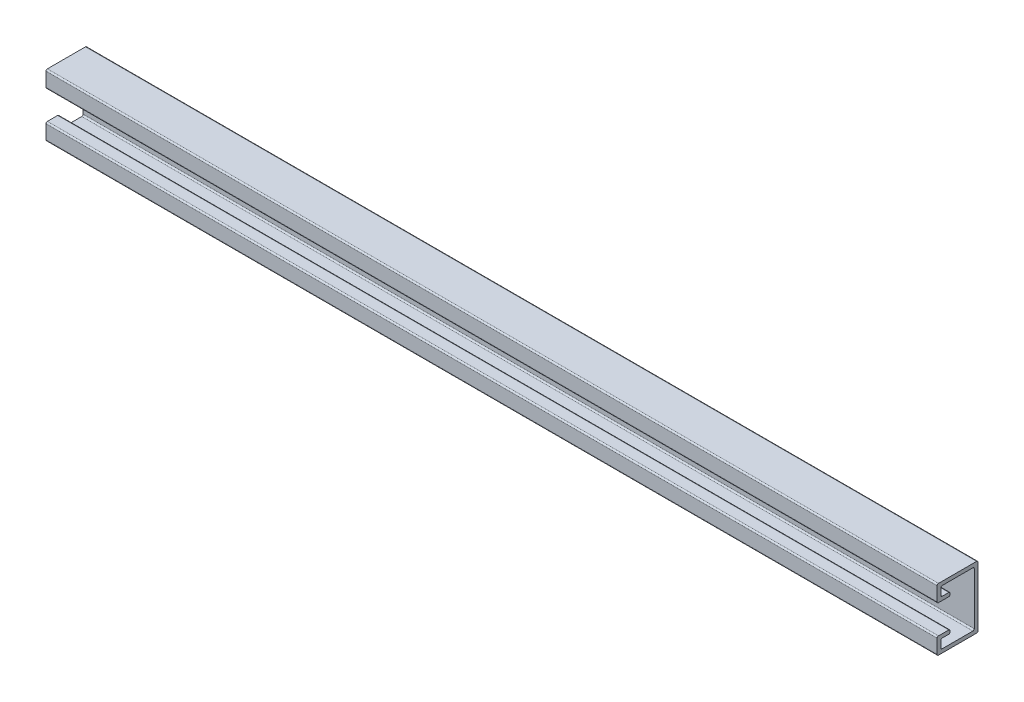
ISO-10303-21;
HEADER;
FILE_DESCRIPTION(('STEP AP214'),'2;1');
FILE_NAME('part.step','',(''),(''),'','','');
FILE_SCHEMA(('AUTOMOTIVE_DESIGN { 1 0 10303 214 1 1 1 1 }'));
ENDSEC;
DATA;
#1=APPLICATION_CONTEXT('core data for automotive mechanical design processes');
#2=APPLICATION_PROTOCOL_DEFINITION('international standard','automotive_design',2000,#1);
#3=PRODUCT_CONTEXT('',#1,'mechanical');
#4=PRODUCT('Part','Part','',(#3));
#5=PRODUCT_RELATED_PRODUCT_CATEGORY('part','',(#4));
#6=PRODUCT_DEFINITION_FORMATION('','',#4);
#7=PRODUCT_DEFINITION_CONTEXT('part definition',#1,'design');
#8=PRODUCT_DEFINITION('design','',#6,#7);
#9=PRODUCT_DEFINITION_SHAPE('','',#8);
#10=(LENGTH_UNIT() NAMED_UNIT(*) SI_UNIT(.MILLI.,.METRE.));
#11=(NAMED_UNIT(*) PLANE_ANGLE_UNIT() SI_UNIT($,.RADIAN.));
#12=(NAMED_UNIT(*) SI_UNIT($,.STERADIAN.) SOLID_ANGLE_UNIT());
#13=UNCERTAINTY_MEASURE_WITH_UNIT(LENGTH_MEASURE(1.E-05),#10,'distance_accuracy_value','');
#14=(GEOMETRIC_REPRESENTATION_CONTEXT(3) GLOBAL_UNCERTAINTY_ASSIGNED_CONTEXT((#13)) GLOBAL_UNIT_ASSIGNED_CONTEXT((#10,
#11,#12)) REPRESENTATION_CONTEXT('',''));
#15=CARTESIAN_POINT('',(0.,0.,0.));
#16=DIRECTION('',(0.,0.,1.));
#17=DIRECTION('',(1.,0.,0.));
#18=AXIS2_PLACEMENT_3D('',#15,#16,#17);
#19=CARTESIAN_POINT('',(1219.2,12.7,45.72));
#20=DIRECTION('',(0.,1.,0.));
#21=DIRECTION('',(0.,0.,1.));
#22=AXIS2_PLACEMENT_3D('',#19,#20,#21);
#23=PLANE('',#22);
#24=DIRECTION('',(0.,0.,-1.));
#25=VECTOR('',#24,1.);
#26=CARTESIAN_POINT('',(1219.2,12.7,45.72));
#27=LINE('',#26,#25);
#28=CARTESIAN_POINT('',(1219.2,12.7,43.815));
#29=VERTEX_POINT('',#28);
#30=CARTESIAN_POINT('',(1219.2,12.7,34.925));
#31=VERTEX_POINT('',#30);
#32=EDGE_CURVE('E263',#29,#31,#27,.T.);
#33=ORIENTED_EDGE('',*,*,#32,.F.);
#34=DIRECTION('',(-1.,0.,0.));
#35=VECTOR('',#34,1.);
#36=CARTESIAN_POINT('',(0.,12.7,43.815));
#37=LINE('',#36,#35);
#38=CARTESIAN_POINT('',(0.,12.7,43.815));
#39=VERTEX_POINT('',#38);
#40=EDGE_CURVE('E248',#29,#39,#37,.T.);
#41=ORIENTED_EDGE('',*,*,#40,.T.);
#42=DIRECTION('',(0.,0.,-1.));
#43=VECTOR('',#42,1.);
#44=CARTESIAN_POINT('',(0.,12.7,45.72));
#45=LINE('',#44,#43);
#46=CARTESIAN_POINT('',(0.,12.7,34.925));
#47=VERTEX_POINT('',#46);
#48=EDGE_CURVE('E260',#39,#47,#45,.T.);
#49=ORIENTED_EDGE('',*,*,#48,.T.);
#50=DIRECTION('',(-1.,0.,0.));
#51=VECTOR('',#50,1.);
#52=CARTESIAN_POINT('',(1219.2,12.7,34.925));
#53=LINE('',#52,#51);
#54=EDGE_CURVE('E265',#47,#31,#53,.F.);
#55=ORIENTED_EDGE('',*,*,#54,.T.);
#56=EDGE_LOOP('',(#33,#41,#49,#55));
#57=FACE_BOUND('',#56,.T.);
#58=ADVANCED_FACE('F34',(#57),#23,.F.);
#59=CARTESIAN_POINT('',(1219.2,17.78,33.02));
#60=DIRECTION('',(0.,0.,-1.));
#61=DIRECTION('',(-1.,0.,0.));
#62=AXIS2_PLACEMENT_3D('',#59,#60,#61);
#63=PLANE('',#62);
#64=DIRECTION('',(0.,-1.,0.));
#65=VECTOR('',#64,1.);
#66=CARTESIAN_POINT('',(1219.2,17.78,33.02));
#67=LINE('',#66,#65);
#68=CARTESIAN_POINT('',(1219.2,15.875,33.02));
#69=VERTEX_POINT('',#68);
#70=CARTESIAN_POINT('',(1219.2,14.605,33.02));
#71=VERTEX_POINT('',#70);
#72=EDGE_CURVE('E496',#69,#71,#67,.T.);
#73=ORIENTED_EDGE('',*,*,#72,.T.);
#74=DIRECTION('',(-1.,0.,0.));
#75=VECTOR('',#74,1.);
#76=CARTESIAN_POINT('',(0.,14.605,33.02));
#77=LINE('',#76,#75);
#78=CARTESIAN_POINT('',(0.,14.605,33.02));
#79=VERTEX_POINT('',#78);
#80=EDGE_CURVE('E406',#71,#79,#77,.T.);
#81=ORIENTED_EDGE('',*,*,#80,.T.);
#82=DIRECTION('',(0.,-1.,0.));
#83=VECTOR('',#82,1.);
#84=CARTESIAN_POINT('',(0.,17.78,33.02));
#85=LINE('',#84,#83);
#86=CARTESIAN_POINT('',(0.,15.875,33.02));
#87=VERTEX_POINT('',#86);
#88=EDGE_CURVE('E271',#87,#79,#85,.T.);
#89=ORIENTED_EDGE('',*,*,#88,.F.);
#90=DIRECTION('',(-1.,0.,0.));
#91=VECTOR('',#90,1.);
#92=CARTESIAN_POINT('',(1219.2,15.875,33.02));
#93=LINE('',#92,#91);
#94=EDGE_CURVE('E404',#87,#69,#93,.F.);
#95=ORIENTED_EDGE('',*,*,#94,.T.);
#96=EDGE_LOOP('',(#73,#81,#89,#95));
#97=FACE_BOUND('',#96,.T.);
#98=ADVANCED_FACE('F507',(#97),#63,.T.);
#99=CARTESIAN_POINT('',(1219.2,17.78,45.72));
#100=DIRECTION('',(0.,1.,0.));
#101=DIRECTION('',(0.,0.,1.));
#102=AXIS2_PLACEMENT_3D('',#99,#100,#101);
#103=PLANE('',#102);
#104=DIRECTION('',(0.,0.,-1.));
#105=VECTOR('',#104,1.);
#106=CARTESIAN_POINT('',(0.,17.78,45.72));
#107=LINE('',#106,#105);
#108=CARTESIAN_POINT('',(0.,17.78,48.895));
#109=VERTEX_POINT('',#108);
#110=CARTESIAN_POINT('',(0.,17.78,34.925));
#111=VERTEX_POINT('',#110);
#112=EDGE_CURVE('E273',#109,#111,#107,.T.);
#113=ORIENTED_EDGE('',*,*,#112,.F.);
#114=DIRECTION('',(-1.,0.,0.));
#115=VECTOR('',#114,1.);
#116=CARTESIAN_POINT('',(1219.2,17.78,48.895));
#117=LINE('',#116,#115);
#118=CARTESIAN_POINT('',(1219.2,17.78,48.895));
#119=VERTEX_POINT('',#118);
#120=EDGE_CURVE('E402',#109,#119,#117,.F.);
#121=ORIENTED_EDGE('',*,*,#120,.T.);
#122=DIRECTION('',(0.,0.,-1.));
#123=VECTOR('',#122,1.);
#124=CARTESIAN_POINT('',(1219.2,17.78,45.72));
#125=LINE('',#124,#123);
#126=CARTESIAN_POINT('',(1219.2,17.78,34.925));
#127=VERTEX_POINT('',#126);
#128=EDGE_CURVE('E493',#119,#127,#125,.T.);
#129=ORIENTED_EDGE('',*,*,#128,.T.);
#130=DIRECTION('',(-1.,0.,0.));
#131=VECTOR('',#130,1.);
#132=CARTESIAN_POINT('',(1219.2,17.78,34.925));
#133=LINE('',#132,#131);
#134=EDGE_CURVE('E399',#127,#111,#133,.T.);
#135=ORIENTED_EDGE('',*,*,#134,.T.);
#136=EDGE_LOOP('',(#113,#121,#129,#135));
#137=FACE_BOUND('',#136,.T.);
#138=ADVANCED_FACE('F515',(#137),#103,.T.);
#139=CARTESIAN_POINT('',(1219.2,0.,50.8));
#140=DIRECTION('',(0.,0.,1.));
#141=DIRECTION('',(0.,-1.,0.));
#142=AXIS2_PLACEMENT_3D('',#139,#140,#141);
#143=PLANE('',#142);
#144=DIRECTION('',(0.,1.,0.));
#145=VECTOR('',#144,1.);
#146=CARTESIAN_POINT('',(0.,0.,50.8));
#147=LINE('',#146,#145);
#148=CARTESIAN_POINT('',(0.,-3.175,50.8));
#149=VERTEX_POINT('',#148);
#150=CARTESIAN_POINT('',(0.,15.875,50.8));
#151=VERTEX_POINT('',#150);
#152=EDGE_CURVE('E281',#149,#151,#147,.T.);
#153=ORIENTED_EDGE('',*,*,#152,.F.);
#154=DIRECTION('',(-1.,0.,0.));
#155=VECTOR('',#154,1.);
#156=CARTESIAN_POINT('',(1219.2,-3.175,50.8));
#157=LINE('',#156,#155);
#158=CARTESIAN_POINT('',(1219.2,-3.175,50.8));
#159=VERTEX_POINT('',#158);
#160=EDGE_CURVE('E378',#149,#159,#157,.F.);
#161=ORIENTED_EDGE('',*,*,#160,.T.);
#162=DIRECTION('',(0.,1.,0.));
#163=VECTOR('',#162,1.);
#164=CARTESIAN_POINT('',(1219.2,0.,50.8));
#165=LINE('',#164,#163);
#166=CARTESIAN_POINT('',(1219.2,15.875,50.8));
#167=VERTEX_POINT('',#166);
#168=EDGE_CURVE('E490',#159,#167,#165,.T.);
#169=ORIENTED_EDGE('',*,*,#168,.T.);
#170=DIRECTION('',(-1.,0.,0.));
#171=VECTOR('',#170,1.);
#172=CARTESIAN_POINT('',(1219.2,15.875,50.8));
#173=LINE('',#172,#171);
#174=EDGE_CURVE('E375',#167,#151,#173,.T.);
#175=ORIENTED_EDGE('',*,*,#174,.T.);
#176=EDGE_LOOP('',(#153,#161,#169,#175));
#177=FACE_BOUND('',#176,.T.);
#178=ADVANCED_FACE('F525',(#177),#143,.T.);
#179=CARTESIAN_POINT('',(1219.2,-5.08,0.));
#180=DIRECTION('',(0.,-1.,0.));
#181=DIRECTION('',(0.,0.,-1.));
#182=AXIS2_PLACEMENT_3D('',#179,#180,#181);
#183=PLANE('',#182);
#184=DIRECTION('',(0.,0.,-1.));
#185=VECTOR('',#184,1.);
#186=CARTESIAN_POINT('',(1219.2,-5.08,0.));
#187=LINE('',#186,#185);
#188=CARTESIAN_POINT('',(1219.2,-5.08,-3.175));
#189=VERTEX_POINT('',#188);
#190=CARTESIAN_POINT('',(1219.2,-5.08,48.895));
#191=VERTEX_POINT('',#190);
#192=EDGE_CURVE('E487',#189,#191,#187,.F.);
#193=ORIENTED_EDGE('',*,*,#192,.T.);
#194=DIRECTION('',(-1.,0.,0.));
#195=VECTOR('',#194,1.);
#196=CARTESIAN_POINT('',(1219.2,-5.08,48.895));
#197=LINE('',#196,#195);
#198=CARTESIAN_POINT('',(0.,-5.08,48.895));
#199=VERTEX_POINT('',#198);
#200=EDGE_CURVE('E372',#191,#199,#197,.T.);
#201=ORIENTED_EDGE('',*,*,#200,.T.);
#202=DIRECTION('',(0.,0.,-1.));
#203=VECTOR('',#202,1.);
#204=CARTESIAN_POINT('',(0.,-5.08,0.));
#205=LINE('',#204,#203);
#206=CARTESIAN_POINT('',(0.,-5.08,-3.175));
#207=VERTEX_POINT('',#206);
#208=EDGE_CURVE('E284',#207,#199,#205,.F.);
#209=ORIENTED_EDGE('',*,*,#208,.F.);
#210=DIRECTION('',(-1.,0.,0.));
#211=VECTOR('',#210,1.);
#212=CARTESIAN_POINT('',(1219.2,-5.08,-3.175));
#213=LINE('',#212,#211);
#214=EDGE_CURVE('E370',#207,#189,#213,.F.);
#215=ORIENTED_EDGE('',*,*,#214,.T.);
#216=EDGE_LOOP('',(#193,#201,#209,#215));
#217=FACE_BOUND('',#216,.T.);
#218=ADVANCED_FACE('F533',(#217),#183,.T.);
#219=CARTESIAN_POINT('',(1219.2,0.,-5.08));
#220=DIRECTION('',(0.,0.,-1.));
#221=DIRECTION('',(-1.,0.,0.));
#222=AXIS2_PLACEMENT_3D('',#219,#220,#221);
#223=PLANE('',#222);
#224=DIRECTION('',(0.,1.,0.));
#225=VECTOR('',#224,1.);
#226=CARTESIAN_POINT('',(1219.2,0.,-5.08));
#227=LINE('',#226,#225);
#228=CARTESIAN_POINT('',(1219.2,78.105,-5.08));
#229=VERTEX_POINT('',#228);
#230=CARTESIAN_POINT('',(1219.2,-3.175,-5.08));
#231=VERTEX_POINT('',#230);
#232=EDGE_CURVE('E484',#229,#231,#227,.F.);
#233=ORIENTED_EDGE('',*,*,#232,.T.);
#234=DIRECTION('',(-1.,0.,0.));
#235=VECTOR('',#234,1.);
#236=CARTESIAN_POINT('',(1219.2,-3.175,-5.08));
#237=LINE('',#236,#235);
#238=CARTESIAN_POINT('',(0.,-3.175,-5.08));
#239=VERTEX_POINT('',#238);
#240=EDGE_CURVE('E391',#231,#239,#237,.T.);
#241=ORIENTED_EDGE('',*,*,#240,.T.);
#242=DIRECTION('',(0.,1.,0.));
#243=VECTOR('',#242,1.);
#244=CARTESIAN_POINT('',(0.,0.,-5.08));
#245=LINE('',#244,#243);
#246=CARTESIAN_POINT('',(0.,78.105,-5.08));
#247=VERTEX_POINT('',#246);
#248=EDGE_CURVE('E287',#247,#239,#245,.F.);
#249=ORIENTED_EDGE('',*,*,#248,.F.);
#250=DIRECTION('',(-1.,0.,0.));
#251=VECTOR('',#250,1.);
#252=CARTESIAN_POINT('',(1219.2,78.105,-5.08));
#253=LINE('',#252,#251);
#254=EDGE_CURVE('E389',#247,#229,#253,.F.);
#255=ORIENTED_EDGE('',*,*,#254,.T.);
#256=EDGE_LOOP('',(#233,#241,#249,#255));
#257=FACE_BOUND('',#256,.T.);
#258=ADVANCED_FACE('F543',(#257),#223,.T.);
#259=CARTESIAN_POINT('',(1219.2,80.01,0.));
#260=DIRECTION('',(0.,1.,0.));
#261=DIRECTION('',(0.,0.,1.));
#262=AXIS2_PLACEMENT_3D('',#259,#260,#261);
#263=PLANE('',#262);
#264=DIRECTION('',(0.,0.,-1.));
#265=VECTOR('',#264,1.);
#266=CARTESIAN_POINT('',(0.,80.01,0.));
#267=LINE('',#266,#265);
#268=CARTESIAN_POINT('',(0.,80.01,48.895));
#269=VERTEX_POINT('',#268);
#270=CARTESIAN_POINT('',(0.,80.01,-3.175));
#271=VERTEX_POINT('',#270);
#272=EDGE_CURVE('E290',#269,#271,#267,.T.);
#273=ORIENTED_EDGE('',*,*,#272,.F.);
#274=DIRECTION('',(-1.,0.,0.));
#275=VECTOR('',#274,1.);
#276=CARTESIAN_POINT('',(1219.2,80.01,48.895));
#277=LINE('',#276,#275);
#278=CARTESIAN_POINT('',(1219.2,80.01,48.895));
#279=VERTEX_POINT('',#278);
#280=EDGE_CURVE('E397',#269,#279,#277,.F.);
#281=ORIENTED_EDGE('',*,*,#280,.T.);
#282=DIRECTION('',(0.,0.,-1.));
#283=VECTOR('',#282,1.);
#284=CARTESIAN_POINT('',(1219.2,80.01,0.));
#285=LINE('',#284,#283);
#286=CARTESIAN_POINT('',(1219.2,80.01,-3.175));
#287=VERTEX_POINT('',#286);
#288=EDGE_CURVE('E481',#279,#287,#285,.T.);
#289=ORIENTED_EDGE('',*,*,#288,.T.);
#290=DIRECTION('',(-1.,0.,0.));
#291=VECTOR('',#290,1.);
#292=CARTESIAN_POINT('',(1219.2,80.01,-3.175));
#293=LINE('',#292,#291);
#294=EDGE_CURVE('E394',#287,#271,#293,.T.);
#295=ORIENTED_EDGE('',*,*,#294,.T.);
#296=EDGE_LOOP('',(#273,#281,#289,#295));
#297=FACE_BOUND('',#296,.T.);
#298=ADVANCED_FACE('F551',(#297),#263,.T.);
#299=CARTESIAN_POINT('',(1219.2,74.93,50.8));
#300=DIRECTION('',(0.,0.,1.));
#301=DIRECTION('',(1.,0.,0.));
#302=AXIS2_PLACEMENT_3D('',#299,#300,#301);
#303=PLANE('',#302);
#304=DIRECTION('',(0.,1.,0.));
#305=VECTOR('',#304,1.);
#306=CARTESIAN_POINT('',(0.,74.93,50.8));
#307=LINE('',#306,#305);
#308=CARTESIAN_POINT('',(0.,59.055,50.8));
#309=VERTEX_POINT('',#308);
#310=CARTESIAN_POINT('',(0.,78.105,50.8));
#311=VERTEX_POINT('',#310);
#312=EDGE_CURVE('E293',#309,#311,#307,.T.);
#313=ORIENTED_EDGE('',*,*,#312,.F.);
#314=DIRECTION('',(-1.,0.,0.));
#315=VECTOR('',#314,1.);
#316=CARTESIAN_POINT('',(1219.2,59.055,50.8));
#317=LINE('',#316,#315);
#318=CARTESIAN_POINT('',(1219.2,59.055,50.8));
#319=VERTEX_POINT('',#318);
#320=EDGE_CURVE('E348',#309,#319,#317,.F.);
#321=ORIENTED_EDGE('',*,*,#320,.T.);
#322=DIRECTION('',(0.,1.,0.));
#323=VECTOR('',#322,1.);
#324=CARTESIAN_POINT('',(1219.2,74.93,50.8));
#325=LINE('',#324,#323);
#326=CARTESIAN_POINT('',(1219.2,78.105,50.8));
#327=VERTEX_POINT('',#326);
#328=EDGE_CURVE('E478',#319,#327,#325,.T.);
#329=ORIENTED_EDGE('',*,*,#328,.T.);
#330=DIRECTION('',(-1.,0.,0.));
#331=VECTOR('',#330,1.);
#332=CARTESIAN_POINT('',(1219.2,78.105,50.8));
#333=LINE('',#332,#331);
#334=EDGE_CURVE('E345',#327,#311,#333,.T.);
#335=ORIENTED_EDGE('',*,*,#334,.T.);
#336=EDGE_LOOP('',(#313,#321,#329,#335));
#337=FACE_BOUND('',#336,.T.);
#338=ADVANCED_FACE('F560',(#337),#303,.T.);
#339=CARTESIAN_POINT('',(1219.2,57.15,45.72));
#340=DIRECTION('',(0.,-1.,0.));
#341=DIRECTION('',(0.,0.,-1.));
#342=AXIS2_PLACEMENT_3D('',#339,#340,#341);
#343=PLANE('',#342);
#344=DIRECTION('',(0.,0.,1.));
#345=VECTOR('',#344,1.);
#346=CARTESIAN_POINT('',(1219.2,57.15,45.72));
#347=LINE('',#346,#345);
#348=CARTESIAN_POINT('',(1219.2,57.15,34.925));
#349=VERTEX_POINT('',#348);
#350=CARTESIAN_POINT('',(1219.2,57.15,48.895));
#351=VERTEX_POINT('',#350);
#352=EDGE_CURVE('E475',#349,#351,#347,.T.);
#353=ORIENTED_EDGE('',*,*,#352,.T.);
#354=DIRECTION('',(-1.,0.,0.));
#355=VECTOR('',#354,1.);
#356=CARTESIAN_POINT('',(1219.2,57.15,48.895));
#357=LINE('',#356,#355);
#358=CARTESIAN_POINT('',(0.,57.15,48.895));
#359=VERTEX_POINT('',#358);
#360=EDGE_CURVE('E323',#351,#359,#357,.T.);
#361=ORIENTED_EDGE('',*,*,#360,.T.);
#362=DIRECTION('',(0.,0.,1.));
#363=VECTOR('',#362,1.);
#364=CARTESIAN_POINT('',(0.,57.15,45.72));
#365=LINE('',#364,#363);
#366=CARTESIAN_POINT('',(0.,57.15,34.925));
#367=VERTEX_POINT('',#366);
#368=EDGE_CURVE('E296',#367,#359,#365,.T.);
#369=ORIENTED_EDGE('',*,*,#368,.F.);
#370=DIRECTION('',(-1.,0.,0.));
#371=VECTOR('',#370,1.);
#372=CARTESIAN_POINT('',(1219.2,57.15,34.925));
#373=LINE('',#372,#371);
#374=EDGE_CURVE('E321',#367,#349,#373,.F.);
#375=ORIENTED_EDGE('',*,*,#374,.T.);
#376=EDGE_LOOP('',(#353,#361,#369,#375));
#377=FACE_BOUND('',#376,.T.);
#378=ADVANCED_FACE('F568',(#377),#343,.T.);
#379=CARTESIAN_POINT('',(1219.2,62.23,33.02));
#380=DIRECTION('',(0.,0.,-1.));
#381=DIRECTION('',(-1.,0.,0.));
#382=AXIS2_PLACEMENT_3D('',#379,#380,#381);
#383=PLANE('',#382);
#384=DIRECTION('',(0.,-1.,0.));
#385=VECTOR('',#384,1.);
#386=CARTESIAN_POINT('',(1219.2,62.23,33.02));
#387=LINE('',#386,#385);
#388=CARTESIAN_POINT('',(1219.2,60.325,33.02));
#389=VERTEX_POINT('',#388);
#390=CARTESIAN_POINT('',(1219.2,59.055,33.02));
#391=VERTEX_POINT('',#390);
#392=EDGE_CURVE('E472',#389,#391,#387,.T.);
#393=ORIENTED_EDGE('',*,*,#392,.T.);
#394=DIRECTION('',(-1.,0.,0.));
#395=VECTOR('',#394,1.);
#396=CARTESIAN_POINT('',(1219.2,59.055,33.02));
#397=LINE('',#396,#395);
#398=CARTESIAN_POINT('',(0.,59.055,33.02));
#399=VERTEX_POINT('',#398);
#400=EDGE_CURVE('E411',#391,#399,#397,.T.);
#401=ORIENTED_EDGE('',*,*,#400,.T.);
#402=DIRECTION('',(0.,-1.,0.));
#403=VECTOR('',#402,1.);
#404=CARTESIAN_POINT('',(0.,62.23,33.02));
#405=LINE('',#404,#403);
#406=CARTESIAN_POINT('',(0.,60.325,33.02));
#407=VERTEX_POINT('',#406);
#408=EDGE_CURVE('E298',#407,#399,#405,.T.);
#409=ORIENTED_EDGE('',*,*,#408,.F.);
#410=DIRECTION('',(-1.,0.,0.));
#411=VECTOR('',#410,1.);
#412=CARTESIAN_POINT('',(1219.2,60.325,33.02));
#413=LINE('',#412,#411);
#414=EDGE_CURVE('E409',#407,#389,#413,.F.);
#415=ORIENTED_EDGE('',*,*,#414,.T.);
#416=EDGE_LOOP('',(#393,#401,#409,#415));
#417=FACE_BOUND('',#416,.T.);
#418=ADVANCED_FACE('F578',(#417),#383,.T.);
#419=CARTESIAN_POINT('',(1219.2,62.23,45.72));
#420=DIRECTION('',(0.,-1.,0.));
#421=DIRECTION('',(0.,0.,-1.));
#422=AXIS2_PLACEMENT_3D('',#419,#420,#421);
#423=PLANE('',#422);
#424=DIRECTION('',(0.,0.,1.));
#425=VECTOR('',#424,1.);
#426=CARTESIAN_POINT('',(1219.2,62.23,45.72));
#427=LINE('',#426,#425);
#428=CARTESIAN_POINT('',(1219.2,62.23,34.925));
#429=VERTEX_POINT('',#428);
#430=CARTESIAN_POINT('',(1219.2,62.23,43.815));
#431=VERTEX_POINT('',#430);
#432=EDGE_CURVE('E469',#429,#431,#427,.T.);
#433=ORIENTED_EDGE('',*,*,#432,.F.);
#434=DIRECTION('',(-1.,0.,0.));
#435=VECTOR('',#434,1.);
#436=CARTESIAN_POINT('',(0.,62.23,34.925));
#437=LINE('',#436,#435);
#438=CARTESIAN_POINT('',(0.,62.23,34.925));
#439=VERTEX_POINT('',#438);
#440=EDGE_CURVE('E416',#429,#439,#437,.T.);
#441=ORIENTED_EDGE('',*,*,#440,.T.);
#442=DIRECTION('',(0.,0.,1.));
#443=VECTOR('',#442,1.);
#444=CARTESIAN_POINT('',(0.,62.23,45.72));
#445=LINE('',#444,#443);
#446=CARTESIAN_POINT('',(0.,62.23,43.815));
#447=VERTEX_POINT('',#446);
#448=EDGE_CURVE('E301',#439,#447,#445,.T.);
#449=ORIENTED_EDGE('',*,*,#448,.T.);
#450=DIRECTION('',(-1.,0.,0.));
#451=VECTOR('',#450,1.);
#452=CARTESIAN_POINT('',(1219.2,62.23,43.815));
#453=LINE('',#452,#451);
#454=EDGE_CURVE('E414',#447,#431,#453,.F.);
#455=ORIENTED_EDGE('',*,*,#454,.T.);
#456=EDGE_LOOP('',(#433,#441,#449,#455));
#457=FACE_BOUND('',#456,.T.);
#458=ADVANCED_FACE('F587',(#457),#423,.F.);
#459=CARTESIAN_POINT('',(1219.2,74.93,45.72));
#460=DIRECTION('',(0.,0.,1.));
#461=DIRECTION('',(1.,0.,0.));
#462=AXIS2_PLACEMENT_3D('',#459,#460,#461);
#463=PLANE('',#462);
#464=DIRECTION('',(0.,1.,0.));
#465=VECTOR('',#464,1.);
#466=CARTESIAN_POINT('',(1219.2,74.93,45.72));
#467=LINE('',#466,#465);
#468=CARTESIAN_POINT('',(1219.2,64.135,45.72));
#469=VERTEX_POINT('',#468);
#470=CARTESIAN_POINT('',(1219.2,73.025,45.72));
#471=VERTEX_POINT('',#470);
#472=EDGE_CURVE('E464',#469,#471,#467,.T.);
#473=ORIENTED_EDGE('',*,*,#472,.F.);
#474=DIRECTION('',(-1.,0.,0.));
#475=VECTOR('',#474,1.);
#476=CARTESIAN_POINT('',(0.,64.135,45.72));
#477=LINE('',#476,#475);
#478=CARTESIAN_POINT('',(0.,64.135,45.72));
#479=VERTEX_POINT('',#478);
#480=EDGE_CURVE('E421',#469,#479,#477,.T.);
#481=ORIENTED_EDGE('',*,*,#480,.T.);
#482=DIRECTION('',(0.,1.,0.));
#483=VECTOR('',#482,1.);
#484=CARTESIAN_POINT('',(0.,74.93,45.72));
#485=LINE('',#484,#483);
#486=CARTESIAN_POINT('',(0.,73.025,45.72));
#487=VERTEX_POINT('',#486);
#488=EDGE_CURVE('E304',#479,#487,#485,.T.);
#489=ORIENTED_EDGE('',*,*,#488,.T.);
#490=DIRECTION('',(-1.,0.,0.));
#491=VECTOR('',#490,1.);
#492=CARTESIAN_POINT('',(1219.2,73.025,45.72));
#493=LINE('',#492,#491);
#494=EDGE_CURVE('E419',#487,#471,#493,.F.);
#495=ORIENTED_EDGE('',*,*,#494,.T.);
#496=EDGE_LOOP('',(#473,#481,#489,#495));
#497=FACE_BOUND('',#496,.T.);
#498=ADVANCED_FACE('F596',(#497),#463,.F.);
#499=CARTESIAN_POINT('',(1219.2,74.93,0.));
#500=DIRECTION('',(0.,1.,0.));
#501=DIRECTION('',(0.,0.,1.));
#502=AXIS2_PLACEMENT_3D('',#499,#500,#501);
#503=PLANE('',#502);
#504=DIRECTION('',(0.,0.,-1.));
#505=VECTOR('',#504,1.);
#506=CARTESIAN_POINT('',(1219.2,74.93,0.));
#507=LINE('',#506,#505);
#508=CARTESIAN_POINT('',(1219.2,74.93,43.815));
#509=VERTEX_POINT('',#508);
#510=CARTESIAN_POINT('',(1219.2,74.93,1.905));
#511=VERTEX_POINT('',#510);
#512=EDGE_CURVE('E458',#509,#511,#507,.T.);
#513=ORIENTED_EDGE('',*,*,#512,.F.);
#514=DIRECTION('',(-1.,0.,0.));
#515=VECTOR('',#514,1.);
#516=CARTESIAN_POINT('',(0.,74.93,43.815));
#517=LINE('',#516,#515);
#518=CARTESIAN_POINT('',(0.,74.93,43.815));
#519=VERTEX_POINT('',#518);
#520=EDGE_CURVE('E255',#509,#519,#517,.T.);
#521=ORIENTED_EDGE('',*,*,#520,.T.);
#522=DIRECTION('',(0.,0.,-1.));
#523=VECTOR('',#522,1.);
#524=CARTESIAN_POINT('',(0.,74.93,0.));
#525=LINE('',#524,#523);
#526=CARTESIAN_POINT('',(0.,74.93,1.905));
#527=VERTEX_POINT('',#526);
#528=EDGE_CURVE('E307',#519,#527,#525,.T.);
#529=ORIENTED_EDGE('',*,*,#528,.T.);
#530=DIRECTION('',(-1.,0.,0.));
#531=VECTOR('',#530,1.);
#532=CARTESIAN_POINT('',(1219.2,74.93,1.905));
#533=LINE('',#532,#531);
#534=EDGE_CURVE('E424',#527,#511,#533,.F.);
#535=ORIENTED_EDGE('',*,*,#534,.T.);
#536=EDGE_LOOP('',(#513,#521,#529,#535));
#537=FACE_BOUND('',#536,.T.);
#538=ADVANCED_FACE('F450',(#537),#503,.F.);
#539=CARTESIAN_POINT('',(1219.2,0.,0.));
#540=DIRECTION('',(0.,0.,-1.));
#541=DIRECTION('',(-1.,0.,0.));
#542=AXIS2_PLACEMENT_3D('',#539,#540,#541);
#543=PLANE('',#542);
#544=DIRECTION('',(0.,-1.,0.));
#545=VECTOR('',#544,1.);
#546=CARTESIAN_POINT('',(0.,0.,0.));
#547=LINE('',#546,#545);
#548=CARTESIAN_POINT('',(0.,73.025,0.));
#549=VERTEX_POINT('',#548);
#550=CARTESIAN_POINT('',(0.,1.905,0.));
#551=VERTEX_POINT('',#550);
#552=EDGE_CURVE('E310',#549,#551,#547,.T.);
#553=ORIENTED_EDGE('',*,*,#552,.T.);
#554=DIRECTION('',(-1.,0.,0.));
#555=VECTOR('',#554,1.);
#556=CARTESIAN_POINT('',(1219.2,1.905,0.));
#557=LINE('',#556,#555);
#558=CARTESIAN_POINT('',(1219.2,1.905,0.));
#559=VERTEX_POINT('',#558);
#560=EDGE_CURVE('E387',#551,#559,#557,.F.);
#561=ORIENTED_EDGE('',*,*,#560,.T.);
#562=DIRECTION('',(0.,-1.,0.));
#563=VECTOR('',#562,1.);
#564=CARTESIAN_POINT('',(1219.2,0.,0.));
#565=LINE('',#564,#563);
#566=CARTESIAN_POINT('',(1219.2,73.025,0.));
#567=VERTEX_POINT('',#566);
#568=EDGE_CURVE('E457',#567,#559,#565,.T.);
#569=ORIENTED_EDGE('',*,*,#568,.F.);
#570=DIRECTION('',(-1.,0.,0.));
#571=VECTOR('',#570,1.);
#572=CARTESIAN_POINT('',(0.,73.025,0.));
#573=LINE('',#572,#571);
#574=EDGE_CURVE('E384',#567,#549,#573,.T.);
#575=ORIENTED_EDGE('',*,*,#574,.T.);
#576=EDGE_LOOP('',(#553,#561,#569,#575));
#577=FACE_BOUND('',#576,.T.);
#578=ADVANCED_FACE('F460',(#577),#543,.F.);
#579=CARTESIAN_POINT('',(1219.2,0.,0.));
#580=DIRECTION('',(0.,-1.,0.));
#581=DIRECTION('',(0.,0.,-1.));
#582=AXIS2_PLACEMENT_3D('',#579,#580,#581);
#583=PLANE('',#582);
#584=DIRECTION('',(0.,0.,1.));
#585=VECTOR('',#584,1.);
#586=CARTESIAN_POINT('',(1219.2,0.,0.));
#587=LINE('',#586,#585);
#588=CARTESIAN_POINT('',(1219.2,0.,1.905));
#589=VERTEX_POINT('',#588);
#590=CARTESIAN_POINT('',(1219.2,0.,43.815));
#591=VERTEX_POINT('',#590);
#592=EDGE_CURVE('E462',#589,#591,#587,.T.);
#593=ORIENTED_EDGE('',*,*,#592,.F.);
#594=DIRECTION('',(-1.,0.,0.));
#595=VECTOR('',#594,1.);
#596=CARTESIAN_POINT('',(0.,0.,1.905));
#597=LINE('',#596,#595);
#598=CARTESIAN_POINT('',(0.,0.,1.905));
#599=VERTEX_POINT('',#598);
#600=EDGE_CURVE('E381',#589,#599,#597,.T.);
#601=ORIENTED_EDGE('',*,*,#600,.T.);
#602=DIRECTION('',(0.,0.,1.));
#603=VECTOR('',#602,1.);
#604=CARTESIAN_POINT('',(0.,0.,0.));
#605=LINE('',#604,#603);
#606=CARTESIAN_POINT('',(0.,0.,43.815));
#607=VERTEX_POINT('',#606);
#608=EDGE_CURVE('E313',#599,#607,#605,.T.);
#609=ORIENTED_EDGE('',*,*,#608,.T.);
#610=DIRECTION('',(-1.,0.,0.));
#611=VECTOR('',#610,1.);
#612=CARTESIAN_POINT('',(1219.2,0.,43.815));
#613=LINE('',#612,#611);
#614=EDGE_CURVE('E49',#607,#591,#613,.F.);
#615=ORIENTED_EDGE('',*,*,#614,.T.);
#616=EDGE_LOOP('',(#593,#601,#609,#615));
#617=FACE_BOUND('',#616,.T.);
#618=ADVANCED_FACE('F748',(#617),#583,.F.);
#619=CARTESIAN_POINT('',(1219.2,0.,45.72));
#620=DIRECTION('',(0.,0.,1.));
#621=DIRECTION('',(0.,-1.,0.));
#622=AXIS2_PLACEMENT_3D('',#619,#620,#621);
#623=PLANE('',#622);
#624=DIRECTION('',(0.,1.,0.));
#625=VECTOR('',#624,1.);
#626=CARTESIAN_POINT('',(0.,0.,45.72));
#627=LINE('',#626,#625);
#628=CARTESIAN_POINT('',(0.,1.905,45.72));
#629=VERTEX_POINT('',#628);
#630=CARTESIAN_POINT('',(0.,10.795,45.72));
#631=VERTEX_POINT('',#630);
#632=EDGE_CURVE('E315',#629,#631,#627,.T.);
#633=ORIENTED_EDGE('',*,*,#632,.T.);
#634=DIRECTION('',(-1.,0.,0.));
#635=VECTOR('',#634,1.);
#636=CARTESIAN_POINT('',(1219.2,10.795,45.72));
#637=LINE('',#636,#635);
#638=CARTESIAN_POINT('',(1219.2,10.795,45.72));
#639=VERTEX_POINT('',#638);
#640=EDGE_CURVE('E249',#631,#639,#637,.F.);
#641=ORIENTED_EDGE('',*,*,#640,.T.);
#642=DIRECTION('',(0.,1.,0.));
#643=VECTOR('',#642,1.);
#644=CARTESIAN_POINT('',(1219.2,0.,45.72));
#645=LINE('',#644,#643);
#646=CARTESIAN_POINT('',(1219.2,1.905,45.72));
#647=VERTEX_POINT('',#646);
#648=EDGE_CURVE('E276',#647,#639,#645,.T.);
#649=ORIENTED_EDGE('',*,*,#648,.F.);
#650=DIRECTION('',(-1.,0.,0.));
#651=VECTOR('',#650,1.);
#652=CARTESIAN_POINT('',(0.,1.905,45.72));
#653=LINE('',#652,#651);
#654=EDGE_CURVE('E264',#647,#629,#653,.T.);
#655=ORIENTED_EDGE('',*,*,#654,.T.);
#656=EDGE_LOOP('',(#633,#641,#649,#655));
#657=FACE_BOUND('',#656,.T.);
#658=ADVANCED_FACE('F740',(#657),#623,.F.);
#659=CARTESIAN_POINT('',(1219.2,0.,0.));
#660=DIRECTION('',(-1.,0.,0.));
#661=DIRECTION('',(0.,0.,1.));
#662=AXIS2_PLACEMENT_3D('',#659,#660,#661);
#663=PLANE('',#662);
#664=ORIENTED_EDGE('',*,*,#328,.F.);
#665=CARTESIAN_POINT('',(1219.2,59.055,48.895));
#666=DIRECTION('',(-1.,0.,0.));
#667=DIRECTION('',(0.,0.,1.));
#668=AXIS2_PLACEMENT_3D('',#665,#666,#667);
#669=CIRCLE('',#668,1.905);
#670=EDGE_CURVE('E368',#319,#351,#669,.F.);
#671=ORIENTED_EDGE('',*,*,#670,.T.);
#672=ORIENTED_EDGE('',*,*,#352,.F.);
#673=CARTESIAN_POINT('',(1219.2,59.055,34.925));
#674=DIRECTION('',(-1.,0.,0.));
#675=DIRECTION('',(0.,0.,1.));
#676=AXIS2_PLACEMENT_3D('',#673,#674,#675);
#677=CIRCLE('',#676,1.905);
#678=EDGE_CURVE('E352',#349,#391,#677,.F.);
#679=ORIENTED_EDGE('',*,*,#678,.T.);
#680=ORIENTED_EDGE('',*,*,#392,.F.);
#681=CARTESIAN_POINT('',(1219.2,60.325,34.925));
#682=DIRECTION('',(-1.,0.,0.));
#683=DIRECTION('',(0.,0.,1.));
#684=AXIS2_PLACEMENT_3D('',#681,#682,#683);
#685=CIRCLE('',#684,1.905);
#686=EDGE_CURVE('E350',#389,#429,#685,.F.);
#687=ORIENTED_EDGE('',*,*,#686,.T.);
#688=ORIENTED_EDGE('',*,*,#432,.T.);
#689=CARTESIAN_POINT('',(1219.2,64.135,43.815));
#690=DIRECTION('',(-1.,0.,0.));
#691=DIRECTION('',(0.,0.,1.));
#692=AXIS2_PLACEMENT_3D('',#689,#690,#691);
#693=CIRCLE('',#692,1.905);
#694=EDGE_CURVE('E438',#431,#469,#693,.T.);
#695=ORIENTED_EDGE('',*,*,#694,.T.);
#696=ORIENTED_EDGE('',*,*,#472,.T.);
#697=CARTESIAN_POINT('',(1219.2,73.025,43.815));
#698=DIRECTION('',(-1.,0.,0.));
#699=DIRECTION('',(0.,0.,1.));
#700=AXIS2_PLACEMENT_3D('',#697,#698,#699);
#701=CIRCLE('',#700,1.905);
#702=EDGE_CURVE('E442',#471,#509,#701,.T.);
#703=ORIENTED_EDGE('',*,*,#702,.T.);
#704=ORIENTED_EDGE('',*,*,#512,.T.);
#705=CARTESIAN_POINT('',(1219.2,73.025,1.905));
#706=DIRECTION('',(-1.,0.,0.));
#707=DIRECTION('',(0.,0.,1.));
#708=AXIS2_PLACEMENT_3D('',#705,#706,#707);
#709=CIRCLE('',#708,1.905);
#710=EDGE_CURVE('E11',#511,#567,#709,.T.);
#711=ORIENTED_EDGE('',*,*,#710,.T.);
#712=ORIENTED_EDGE('',*,*,#568,.T.);
#713=CARTESIAN_POINT('',(1219.2,1.905,1.905));
#714=DIRECTION('',(-1.,0.,0.));
#715=DIRECTION('',(0.,0.,1.));
#716=AXIS2_PLACEMENT_3D('',#713,#714,#715);
#717=CIRCLE('',#716,1.905);
#718=EDGE_CURVE('E56',#559,#589,#717,.T.);
#719=ORIENTED_EDGE('',*,*,#718,.T.);
#720=ORIENTED_EDGE('',*,*,#592,.T.);
#721=CARTESIAN_POINT('',(1219.2,1.905,43.815));
#722=DIRECTION('',(-1.,0.,0.));
#723=DIRECTION('',(0.,0.,1.));
#724=AXIS2_PLACEMENT_3D('',#721,#722,#723);
#725=CIRCLE('',#724,1.905);
#726=EDGE_CURVE('E434',#591,#647,#725,.T.);
#727=ORIENTED_EDGE('',*,*,#726,.T.);
#728=ORIENTED_EDGE('',*,*,#648,.T.);
#729=CARTESIAN_POINT('',(1219.2,10.795,43.815));
#730=DIRECTION('',(-1.,0.,0.));
#731=DIRECTION('',(0.,0.,1.));
#732=AXIS2_PLACEMENT_3D('',#729,#730,#731);
#733=CIRCLE('',#732,1.905);
#734=EDGE_CURVE('E254',#639,#29,#733,.T.);
#735=ORIENTED_EDGE('',*,*,#734,.T.);
#736=ORIENTED_EDGE('',*,*,#32,.T.);
#737=CARTESIAN_POINT('',(1219.2,14.605,34.925));
#738=DIRECTION('',(-1.,0.,0.));
#739=DIRECTION('',(0.,0.,1.));
#740=AXIS2_PLACEMENT_3D('',#737,#738,#739);
#741=CIRCLE('',#740,1.905);
#742=EDGE_CURVE('E356',#31,#71,#741,.F.);
#743=ORIENTED_EDGE('',*,*,#742,.T.);
#744=ORIENTED_EDGE('',*,*,#72,.F.);
#745=CARTESIAN_POINT('',(1219.2,15.875,34.925));
#746=DIRECTION('',(-1.,0.,0.));
#747=DIRECTION('',(0.,0.,1.));
#748=AXIS2_PLACEMENT_3D('',#745,#746,#747);
#749=CIRCLE('',#748,1.905);
#750=EDGE_CURVE('E354',#69,#127,#749,.F.);
#751=ORIENTED_EDGE('',*,*,#750,.T.);
#752=ORIENTED_EDGE('',*,*,#128,.F.);
#753=CARTESIAN_POINT('',(1219.2,15.875,48.895));
#754=DIRECTION('',(-1.,0.,0.));
#755=DIRECTION('',(0.,0.,1.));
#756=AXIS2_PLACEMENT_3D('',#753,#754,#755);
#757=CIRCLE('',#756,1.905);
#758=EDGE_CURVE('E358',#119,#167,#757,.F.);
#759=ORIENTED_EDGE('',*,*,#758,.T.);
#760=ORIENTED_EDGE('',*,*,#168,.F.);
#761=CARTESIAN_POINT('',(1219.2,-3.175,48.895));
#762=DIRECTION('',(-1.,0.,0.));
#763=DIRECTION('',(0.,0.,1.));
#764=AXIS2_PLACEMENT_3D('',#761,#762,#763);
#765=CIRCLE('',#764,1.905);
#766=EDGE_CURVE('E366',#159,#191,#765,.F.);
#767=ORIENTED_EDGE('',*,*,#766,.T.);
#768=ORIENTED_EDGE('',*,*,#192,.F.);
#769=CARTESIAN_POINT('',(1219.2,-3.175,-3.175));
#770=DIRECTION('',(-1.,0.,0.));
#771=DIRECTION('',(0.,0.,1.));
#772=AXIS2_PLACEMENT_3D('',#769,#770,#771);
#773=CIRCLE('',#772,1.905);
#774=EDGE_CURVE('E364',#189,#231,#773,.F.);
#775=ORIENTED_EDGE('',*,*,#774,.T.);
#776=ORIENTED_EDGE('',*,*,#232,.F.);
#777=CARTESIAN_POINT('',(1219.2,78.105,-3.175));
#778=DIRECTION('',(-1.,0.,0.));
#779=DIRECTION('',(0.,0.,1.));
#780=AXIS2_PLACEMENT_3D('',#777,#778,#779);
#781=CIRCLE('',#780,1.905);
#782=EDGE_CURVE('E360',#229,#287,#781,.F.);
#783=ORIENTED_EDGE('',*,*,#782,.T.);
#784=ORIENTED_EDGE('',*,*,#288,.F.);
#785=CARTESIAN_POINT('',(1219.2,78.105,48.895));
#786=DIRECTION('',(-1.,0.,0.));
#787=DIRECTION('',(0.,0.,1.));
#788=AXIS2_PLACEMENT_3D('',#785,#786,#787);
#789=CIRCLE('',#788,1.905);
#790=EDGE_CURVE('E362',#279,#327,#789,.F.);
#791=ORIENTED_EDGE('',*,*,#790,.T.);
#792=EDGE_LOOP('',(#664,#671,#672,#679,#680,#687,#688,#695,#696,#703,#704,#711,#712,#719,#720,
#727,#728,#735,#736,#743,#744,#751,#752,#759,#760,#767,#768,#775,#776,#783,#784,#791));
#793=FACE_BOUND('',#792,.T.);
#794=ADVANCED_FACE('F456',(#793),#663,.F.);
#795=CARTESIAN_POINT('',(0.,0.,0.));
#796=DIRECTION('',(-1.,0.,0.));
#797=DIRECTION('',(0.,0.,1.));
#798=AXIS2_PLACEMENT_3D('',#795,#796,#797);
#799=PLANE('',#798);
#800=ORIENTED_EDGE('',*,*,#368,.T.);
#801=CARTESIAN_POINT('',(0.,59.055,48.895));
#802=DIRECTION('',(-1.,0.,0.));
#803=DIRECTION('',(0.,0.,1.));
#804=AXIS2_PLACEMENT_3D('',#801,#802,#803);
#805=CIRCLE('',#804,1.905);
#806=EDGE_CURVE('E343',#359,#309,#805,.T.);
#807=ORIENTED_EDGE('',*,*,#806,.T.);
#808=ORIENTED_EDGE('',*,*,#312,.T.);
#809=CARTESIAN_POINT('',(0.,78.105,48.895));
#810=DIRECTION('',(-1.,0.,0.));
#811=DIRECTION('',(0.,0.,1.));
#812=AXIS2_PLACEMENT_3D('',#809,#810,#811);
#813=CIRCLE('',#812,1.905);
#814=EDGE_CURVE('E337',#311,#269,#813,.T.);
#815=ORIENTED_EDGE('',*,*,#814,.T.);
#816=ORIENTED_EDGE('',*,*,#272,.T.);
#817=CARTESIAN_POINT('',(0.,78.105,-3.175));
#818=DIRECTION('',(-1.,0.,0.));
#819=DIRECTION('',(0.,0.,1.));
#820=AXIS2_PLACEMENT_3D('',#817,#818,#819);
#821=CIRCLE('',#820,1.905);
#822=EDGE_CURVE('E335',#271,#247,#821,.T.);
#823=ORIENTED_EDGE('',*,*,#822,.T.);
#824=ORIENTED_EDGE('',*,*,#248,.T.);
#825=CARTESIAN_POINT('',(0.,-3.175,-3.175));
#826=DIRECTION('',(-1.,0.,0.));
#827=DIRECTION('',(0.,0.,1.));
#828=AXIS2_PLACEMENT_3D('',#825,#826,#827);
#829=CIRCLE('',#828,1.905);
#830=EDGE_CURVE('E339',#239,#207,#829,.T.);
#831=ORIENTED_EDGE('',*,*,#830,.T.);
#832=ORIENTED_EDGE('',*,*,#208,.T.);
#833=CARTESIAN_POINT('',(0.,-3.175,48.895));
#834=DIRECTION('',(-1.,0.,0.));
#835=DIRECTION('',(0.,0.,1.));
#836=AXIS2_PLACEMENT_3D('',#833,#834,#835);
#837=CIRCLE('',#836,1.905);
#838=EDGE_CURVE('E341',#199,#149,#837,.T.);
#839=ORIENTED_EDGE('',*,*,#838,.T.);
#840=ORIENTED_EDGE('',*,*,#152,.T.);
#841=CARTESIAN_POINT('',(0.,15.875,48.895));
#842=DIRECTION('',(-1.,0.,0.));
#843=DIRECTION('',(0.,0.,1.));
#844=AXIS2_PLACEMENT_3D('',#841,#842,#843);
#845=CIRCLE('',#844,1.905);
#846=EDGE_CURVE('E333',#151,#109,#845,.T.);
#847=ORIENTED_EDGE('',*,*,#846,.T.);
#848=ORIENTED_EDGE('',*,*,#112,.T.);
#849=CARTESIAN_POINT('',(0.,15.875,34.925));
#850=DIRECTION('',(-1.,0.,0.));
#851=DIRECTION('',(0.,0.,1.));
#852=AXIS2_PLACEMENT_3D('',#849,#850,#851);
#853=CIRCLE('',#852,1.905);
#854=EDGE_CURVE('E330',#111,#87,#853,.T.);
#855=ORIENTED_EDGE('',*,*,#854,.T.);
#856=ORIENTED_EDGE('',*,*,#88,.T.);
#857=CARTESIAN_POINT('',(0.,14.605,34.925));
#858=DIRECTION('',(-1.,0.,0.));
#859=DIRECTION('',(0.,0.,1.));
#860=AXIS2_PLACEMENT_3D('',#857,#858,#859);
#861=CIRCLE('',#860,1.905);
#862=EDGE_CURVE('E270',#79,#47,#861,.T.);
#863=ORIENTED_EDGE('',*,*,#862,.T.);
#864=ORIENTED_EDGE('',*,*,#48,.F.);
#865=CARTESIAN_POINT('',(0.,10.795,43.815));
#866=DIRECTION('',(-1.,0.,0.));
#867=DIRECTION('',(0.,0.,1.));
#868=AXIS2_PLACEMENT_3D('',#865,#866,#867);
#869=CIRCLE('',#868,1.905);
#870=EDGE_CURVE('E244',#39,#631,#869,.F.);
#871=ORIENTED_EDGE('',*,*,#870,.T.);
#872=ORIENTED_EDGE('',*,*,#632,.F.);
#873=CARTESIAN_POINT('',(0.,1.905,43.815));
#874=DIRECTION('',(-1.,0.,0.));
#875=DIRECTION('',(0.,0.,1.));
#876=AXIS2_PLACEMENT_3D('',#873,#874,#875);
#877=CIRCLE('',#876,1.905);
#878=EDGE_CURVE('E432',#629,#607,#877,.F.);
#879=ORIENTED_EDGE('',*,*,#878,.T.);
#880=ORIENTED_EDGE('',*,*,#608,.F.);
#881=CARTESIAN_POINT('',(0.,1.905,1.905));
#882=DIRECTION('',(-1.,0.,0.));
#883=DIRECTION('',(0.,0.,1.));
#884=AXIS2_PLACEMENT_3D('',#881,#882,#883);
#885=CIRCLE('',#884,1.905);
#886=EDGE_CURVE('E429',#599,#551,#885,.F.);
#887=ORIENTED_EDGE('',*,*,#886,.T.);
#888=ORIENTED_EDGE('',*,*,#552,.F.);
#889=CARTESIAN_POINT('',(0.,73.025,1.905));
#890=DIRECTION('',(-1.,0.,0.));
#891=DIRECTION('',(0.,0.,1.));
#892=AXIS2_PLACEMENT_3D('',#889,#890,#891);
#893=CIRCLE('',#892,1.905);
#894=EDGE_CURVE('E42',#549,#527,#893,.F.);
#895=ORIENTED_EDGE('',*,*,#894,.T.);
#896=ORIENTED_EDGE('',*,*,#528,.F.);
#897=CARTESIAN_POINT('',(0.,73.025,43.815));
#898=DIRECTION('',(-1.,0.,0.));
#899=DIRECTION('',(0.,0.,1.));
#900=AXIS2_PLACEMENT_3D('',#897,#898,#899);
#901=CIRCLE('',#900,1.905);
#902=EDGE_CURVE('E440',#519,#487,#901,.F.);
#903=ORIENTED_EDGE('',*,*,#902,.T.);
#904=ORIENTED_EDGE('',*,*,#488,.F.);
#905=CARTESIAN_POINT('',(0.,64.135,43.815));
#906=DIRECTION('',(-1.,0.,0.));
#907=DIRECTION('',(0.,0.,1.));
#908=AXIS2_PLACEMENT_3D('',#905,#906,#907);
#909=CIRCLE('',#908,1.905);
#910=EDGE_CURVE('E436',#479,#447,#909,.F.);
#911=ORIENTED_EDGE('',*,*,#910,.T.);
#912=ORIENTED_EDGE('',*,*,#448,.F.);
#913=CARTESIAN_POINT('',(0.,60.325,34.925));
#914=DIRECTION('',(-1.,0.,0.));
#915=DIRECTION('',(0.,0.,1.));
#916=AXIS2_PLACEMENT_3D('',#913,#914,#915);
#917=CIRCLE('',#916,1.905);
#918=EDGE_CURVE('E326',#439,#407,#917,.T.);
#919=ORIENTED_EDGE('',*,*,#918,.T.);
#920=ORIENTED_EDGE('',*,*,#408,.T.);
#921=CARTESIAN_POINT('',(0.,59.055,34.925));
#922=DIRECTION('',(-1.,0.,0.));
#923=DIRECTION('',(0.,0.,1.));
#924=AXIS2_PLACEMENT_3D('',#921,#922,#923);
#925=CIRCLE('',#924,1.905);
#926=EDGE_CURVE('E328',#399,#367,#925,.T.);
#927=ORIENTED_EDGE('',*,*,#926,.T.);
#928=EDGE_LOOP('',(#800,#807,#808,#815,#816,#823,#824,#831,#832,#839,#840,#847,#848,#855,#856,
#863,#864,#871,#872,#879,#880,#887,#888,#895,#896,#903,#904,#911,#912,#919,#920,#927));
#929=FACE_BOUND('',#928,.T.);
#930=ADVANCED_FACE('F268',(#929),#799,.T.);
#931=CARTESIAN_POINT('',(1219.2,10.795,43.815));
#932=DIRECTION('',(1.,0.,0.));
#933=DIRECTION('',(0.,0.,-1.));
#934=AXIS2_PLACEMENT_3D('',#931,#932,#933);
#935=CYLINDRICAL_SURFACE('',#934,1.905);
#936=ORIENTED_EDGE('',*,*,#734,.F.);
#937=ORIENTED_EDGE('',*,*,#640,.F.);
#938=ORIENTED_EDGE('',*,*,#870,.F.);
#939=ORIENTED_EDGE('',*,*,#40,.F.);
#940=EDGE_LOOP('',(#936,#937,#938,#939));
#941=FACE_BOUND('',#940,.T.);
#942=ADVANCED_FACE('F247',(#941),#935,.F.);
#943=CARTESIAN_POINT('',(1219.2,59.055,48.895));
#944=DIRECTION('',(-1.,0.,0.));
#945=DIRECTION('',(0.,0.,1.));
#946=AXIS2_PLACEMENT_3D('',#943,#944,#945);
#947=CYLINDRICAL_SURFACE('',#946,1.905);
#948=ORIENTED_EDGE('',*,*,#670,.F.);
#949=ORIENTED_EDGE('',*,*,#320,.F.);
#950=ORIENTED_EDGE('',*,*,#806,.F.);
#951=ORIENTED_EDGE('',*,*,#360,.F.);
#952=EDGE_LOOP('',(#948,#949,#950,#951));
#953=FACE_BOUND('',#952,.T.);
#954=ADVANCED_FACE('F566',(#953),#947,.T.);
#955=CARTESIAN_POINT('',(1219.2,-3.175,48.895));
#956=DIRECTION('',(-1.,0.,0.));
#957=DIRECTION('',(0.,0.,1.));
#958=AXIS2_PLACEMENT_3D('',#955,#956,#957);
#959=CYLINDRICAL_SURFACE('',#958,1.905);
#960=ORIENTED_EDGE('',*,*,#766,.F.);
#961=ORIENTED_EDGE('',*,*,#160,.F.);
#962=ORIENTED_EDGE('',*,*,#838,.F.);
#963=ORIENTED_EDGE('',*,*,#200,.F.);
#964=EDGE_LOOP('',(#960,#961,#962,#963));
#965=FACE_BOUND('',#964,.T.);
#966=ADVANCED_FACE('F531',(#965),#959,.T.);
#967=CARTESIAN_POINT('',(1219.2,1.905,1.905));
#968=DIRECTION('',(1.,0.,0.));
#969=DIRECTION('',(0.,0.,-1.));
#970=AXIS2_PLACEMENT_3D('',#967,#968,#969);
#971=CYLINDRICAL_SURFACE('',#970,1.905);
#972=ORIENTED_EDGE('',*,*,#718,.F.);
#973=ORIENTED_EDGE('',*,*,#560,.F.);
#974=ORIENTED_EDGE('',*,*,#886,.F.);
#975=ORIENTED_EDGE('',*,*,#600,.F.);
#976=EDGE_LOOP('',(#972,#973,#974,#975));
#977=FACE_BOUND('',#976,.T.);
#978=ADVANCED_FACE('F621',(#977),#971,.F.);
#979=CARTESIAN_POINT('',(1219.2,-3.175,-3.175));
#980=DIRECTION('',(-1.,0.,0.));
#981=DIRECTION('',(0.,0.,1.));
#982=AXIS2_PLACEMENT_3D('',#979,#980,#981);
#983=CYLINDRICAL_SURFACE('',#982,1.905);
#984=ORIENTED_EDGE('',*,*,#774,.F.);
#985=ORIENTED_EDGE('',*,*,#214,.F.);
#986=ORIENTED_EDGE('',*,*,#830,.F.);
#987=ORIENTED_EDGE('',*,*,#240,.F.);
#988=EDGE_LOOP('',(#984,#985,#986,#987));
#989=FACE_BOUND('',#988,.T.);
#990=ADVANCED_FACE('F540',(#989),#983,.T.);
#991=CARTESIAN_POINT('',(1219.2,78.105,48.895));
#992=DIRECTION('',(-1.,0.,0.));
#993=DIRECTION('',(0.,0.,1.));
#994=AXIS2_PLACEMENT_3D('',#991,#992,#993);
#995=CYLINDRICAL_SURFACE('',#994,1.905);
#996=ORIENTED_EDGE('',*,*,#790,.F.);
#997=ORIENTED_EDGE('',*,*,#280,.F.);
#998=ORIENTED_EDGE('',*,*,#814,.F.);
#999=ORIENTED_EDGE('',*,*,#334,.F.);
#1000=EDGE_LOOP('',(#996,#997,#998,#999));
#1001=FACE_BOUND('',#1000,.T.);
#1002=ADVANCED_FACE('F557',(#1001),#995,.T.);
#1003=CARTESIAN_POINT('',(1219.2,78.105,-3.175));
#1004=DIRECTION('',(-1.,0.,0.));
#1005=DIRECTION('',(0.,0.,1.));
#1006=AXIS2_PLACEMENT_3D('',#1003,#1004,#1005);
#1007=CYLINDRICAL_SURFACE('',#1006,1.905);
#1008=ORIENTED_EDGE('',*,*,#782,.F.);
#1009=ORIENTED_EDGE('',*,*,#254,.F.);
#1010=ORIENTED_EDGE('',*,*,#822,.F.);
#1011=ORIENTED_EDGE('',*,*,#294,.F.);
#1012=EDGE_LOOP('',(#1008,#1009,#1010,#1011));
#1013=FACE_BOUND('',#1012,.T.);
#1014=ADVANCED_FACE('F549',(#1013),#1007,.T.);
#1015=CARTESIAN_POINT('',(1219.2,1.905,43.815));
#1016=DIRECTION('',(1.,0.,0.));
#1017=DIRECTION('',(0.,0.,-1.));
#1018=AXIS2_PLACEMENT_3D('',#1015,#1016,#1017);
#1019=CYLINDRICAL_SURFACE('',#1018,1.905);
#1020=ORIENTED_EDGE('',*,*,#726,.F.);
#1021=ORIENTED_EDGE('',*,*,#614,.F.);
#1022=ORIENTED_EDGE('',*,*,#878,.F.);
#1023=ORIENTED_EDGE('',*,*,#654,.F.);
#1024=EDGE_LOOP('',(#1020,#1021,#1022,#1023));
#1025=FACE_BOUND('',#1024,.T.);
#1026=ADVANCED_FACE('F631',(#1025),#1019,.F.);
#1027=CARTESIAN_POINT('',(1219.2,15.875,48.895));
#1028=DIRECTION('',(-1.,0.,0.));
#1029=DIRECTION('',(0.,0.,1.));
#1030=AXIS2_PLACEMENT_3D('',#1027,#1028,#1029);
#1031=CYLINDRICAL_SURFACE('',#1030,1.905);
#1032=ORIENTED_EDGE('',*,*,#758,.F.);
#1033=ORIENTED_EDGE('',*,*,#120,.F.);
#1034=ORIENTED_EDGE('',*,*,#846,.F.);
#1035=ORIENTED_EDGE('',*,*,#174,.F.);
#1036=EDGE_LOOP('',(#1032,#1033,#1034,#1035));
#1037=FACE_BOUND('',#1036,.T.);
#1038=ADVANCED_FACE('F522',(#1037),#1031,.T.);
#1039=CARTESIAN_POINT('',(1219.2,14.605,34.925));
#1040=DIRECTION('',(1.,0.,0.));
#1041=DIRECTION('',(0.,0.,-1.));
#1042=AXIS2_PLACEMENT_3D('',#1039,#1040,#1041);
#1043=CYLINDRICAL_SURFACE('',#1042,1.905);
#1044=ORIENTED_EDGE('',*,*,#742,.F.);
#1045=ORIENTED_EDGE('',*,*,#54,.F.);
#1046=ORIENTED_EDGE('',*,*,#862,.F.);
#1047=ORIENTED_EDGE('',*,*,#80,.F.);
#1048=EDGE_LOOP('',(#1044,#1045,#1046,#1047));
#1049=FACE_BOUND('',#1048,.T.);
#1050=ADVANCED_FACE('F504',(#1049),#1043,.T.);
#1051=CARTESIAN_POINT('',(1219.2,15.875,34.925));
#1052=DIRECTION('',(-1.,0.,0.));
#1053=DIRECTION('',(0.,0.,1.));
#1054=AXIS2_PLACEMENT_3D('',#1051,#1052,#1053);
#1055=CYLINDRICAL_SURFACE('',#1054,1.905);
#1056=ORIENTED_EDGE('',*,*,#750,.F.);
#1057=ORIENTED_EDGE('',*,*,#94,.F.);
#1058=ORIENTED_EDGE('',*,*,#854,.F.);
#1059=ORIENTED_EDGE('',*,*,#134,.F.);
#1060=EDGE_LOOP('',(#1056,#1057,#1058,#1059));
#1061=FACE_BOUND('',#1060,.T.);
#1062=ADVANCED_FACE('F513',(#1061),#1055,.T.);
#1063=CARTESIAN_POINT('',(1219.2,59.055,34.925));
#1064=DIRECTION('',(-1.,0.,0.));
#1065=DIRECTION('',(0.,0.,1.));
#1066=AXIS2_PLACEMENT_3D('',#1063,#1064,#1065);
#1067=CYLINDRICAL_SURFACE('',#1066,1.905);
#1068=ORIENTED_EDGE('',*,*,#678,.F.);
#1069=ORIENTED_EDGE('',*,*,#374,.F.);
#1070=ORIENTED_EDGE('',*,*,#926,.F.);
#1071=ORIENTED_EDGE('',*,*,#400,.F.);
#1072=EDGE_LOOP('',(#1068,#1069,#1070,#1071));
#1073=FACE_BOUND('',#1072,.T.);
#1074=ADVANCED_FACE('F575',(#1073),#1067,.T.);
#1075=CARTESIAN_POINT('',(1219.2,60.325,34.925));
#1076=DIRECTION('',(1.,0.,0.));
#1077=DIRECTION('',(0.,0.,-1.));
#1078=AXIS2_PLACEMENT_3D('',#1075,#1076,#1077);
#1079=CYLINDRICAL_SURFACE('',#1078,1.905);
#1080=ORIENTED_EDGE('',*,*,#686,.F.);
#1081=ORIENTED_EDGE('',*,*,#414,.F.);
#1082=ORIENTED_EDGE('',*,*,#918,.F.);
#1083=ORIENTED_EDGE('',*,*,#440,.F.);
#1084=EDGE_LOOP('',(#1080,#1081,#1082,#1083));
#1085=FACE_BOUND('',#1084,.T.);
#1086=ADVANCED_FACE('F584',(#1085),#1079,.T.);
#1087=CARTESIAN_POINT('',(1219.2,64.135,43.815));
#1088=DIRECTION('',(1.,0.,0.));
#1089=DIRECTION('',(0.,0.,-1.));
#1090=AXIS2_PLACEMENT_3D('',#1087,#1088,#1089);
#1091=CYLINDRICAL_SURFACE('',#1090,1.905);
#1092=ORIENTED_EDGE('',*,*,#694,.F.);
#1093=ORIENTED_EDGE('',*,*,#454,.F.);
#1094=ORIENTED_EDGE('',*,*,#910,.F.);
#1095=ORIENTED_EDGE('',*,*,#480,.F.);
#1096=EDGE_LOOP('',(#1092,#1093,#1094,#1095));
#1097=FACE_BOUND('',#1096,.T.);
#1098=ADVANCED_FACE('F593',(#1097),#1091,.F.);
#1099=CARTESIAN_POINT('',(1219.2,73.025,43.815));
#1100=DIRECTION('',(1.,0.,0.));
#1101=DIRECTION('',(0.,0.,-1.));
#1102=AXIS2_PLACEMENT_3D('',#1099,#1100,#1101);
#1103=CYLINDRICAL_SURFACE('',#1102,1.905);
#1104=ORIENTED_EDGE('',*,*,#702,.F.);
#1105=ORIENTED_EDGE('',*,*,#494,.F.);
#1106=ORIENTED_EDGE('',*,*,#902,.F.);
#1107=ORIENTED_EDGE('',*,*,#520,.F.);
#1108=EDGE_LOOP('',(#1104,#1105,#1106,#1107));
#1109=FACE_BOUND('',#1108,.T.);
#1110=ADVANCED_FACE('F600',(#1109),#1103,.F.);
#1111=CARTESIAN_POINT('',(1219.2,73.025,1.905));
#1112=DIRECTION('',(1.,0.,0.));
#1113=DIRECTION('',(0.,0.,-1.));
#1114=AXIS2_PLACEMENT_3D('',#1111,#1112,#1113);
#1115=CYLINDRICAL_SURFACE('',#1114,1.905);
#1116=ORIENTED_EDGE('',*,*,#710,.F.);
#1117=ORIENTED_EDGE('',*,*,#534,.F.);
#1118=ORIENTED_EDGE('',*,*,#894,.F.);
#1119=ORIENTED_EDGE('',*,*,#574,.F.);
#1120=EDGE_LOOP('',(#1116,#1117,#1118,#1119));
#1121=FACE_BOUND('',#1120,.T.);
#1122=ADVANCED_FACE('F36',(#1121),#1115,.F.);
#1123=CLOSED_SHELL('',(#58,#98,#138,#178,#218,#258,#298,#338,#378,#418,#458,#498,#538,#578,#618,
#658,#794,#930,#942,#954,#966,#978,#990,#1002,#1014,#1026,#1038,#1050,#1062,#1074,#1086,#1098,
#1110,#1122));
#1124=MANIFOLD_SOLID_BREP('B2',#1123);
#1125=ADVANCED_BREP_SHAPE_REPRESENTATION('',(#18,#1124),#14);
#1126=SHAPE_DEFINITION_REPRESENTATION(#9,#1125);
ENDSEC;
END-ISO-10303-21;
